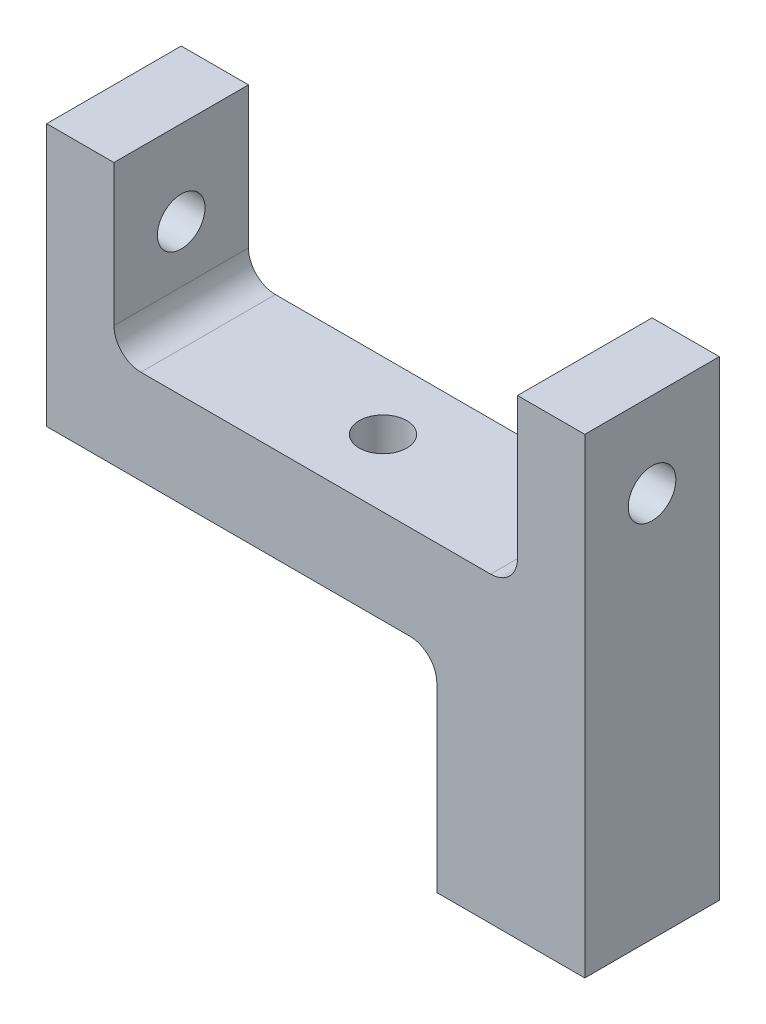
ISO-10303-21;
HEADER;
FILE_DESCRIPTION(('STEP AP214'),'2;1');
FILE_NAME('part.step','',(''),(''),'','','');
FILE_SCHEMA(('AUTOMOTIVE_DESIGN { 1 0 10303 214 1 1 1 1 }'));
ENDSEC;
DATA;
#1=APPLICATION_CONTEXT('core data for automotive mechanical design processes');
#2=APPLICATION_PROTOCOL_DEFINITION('international standard','automotive_design',2000,#1);
#3=PRODUCT_CONTEXT('',#1,'mechanical');
#4=PRODUCT('Part','Part','',(#3));
#5=PRODUCT_RELATED_PRODUCT_CATEGORY('part','',(#4));
#6=PRODUCT_DEFINITION_FORMATION('','',#4);
#7=PRODUCT_DEFINITION_CONTEXT('part definition',#1,'design');
#8=PRODUCT_DEFINITION('design','',#6,#7);
#9=PRODUCT_DEFINITION_SHAPE('','',#8);
#10=(LENGTH_UNIT() NAMED_UNIT(*) SI_UNIT(.MILLI.,.METRE.));
#11=(NAMED_UNIT(*) PLANE_ANGLE_UNIT() SI_UNIT($,.RADIAN.));
#12=(NAMED_UNIT(*) SI_UNIT($,.STERADIAN.) SOLID_ANGLE_UNIT());
#13=UNCERTAINTY_MEASURE_WITH_UNIT(LENGTH_MEASURE(1.E-05),#10,'distance_accuracy_value','');
#14=(GEOMETRIC_REPRESENTATION_CONTEXT(3) GLOBAL_UNCERTAINTY_ASSIGNED_CONTEXT((#13)) GLOBAL_UNIT_ASSIGNED_CONTEXT((#10,
#11,#12)) REPRESENTATION_CONTEXT('',''));
#15=CARTESIAN_POINT('',(0.,0.,0.));
#16=DIRECTION('',(0.,0.,1.));
#17=DIRECTION('',(1.,0.,0.));
#18=AXIS2_PLACEMENT_3D('',#15,#16,#17);
#19=CARTESIAN_POINT('',(25.4,44.45,6.35));
#20=DIRECTION('',(-1.,0.,0.));
#21=DIRECTION('',(0.,0.,1.));
#22=AXIS2_PLACEMENT_3D('',#19,#20,#21);
#23=PLANE('',#22);
#24=DIRECTION('',(0.,0.,-1.));
#25=VECTOR('',#24,1.);
#26=CARTESIAN_POINT('',(25.4,0.,6.35));
#27=LINE('',#26,#25);
#28=CARTESIAN_POINT('',(25.4,0.,6.35));
#29=VERTEX_POINT('',#28);
#30=CARTESIAN_POINT('',(25.4,0.,-6.35));
#31=VERTEX_POINT('',#30);
#32=EDGE_CURVE('E183',#29,#31,#27,.T.);
#33=ORIENTED_EDGE('',*,*,#32,.T.);
#34=DIRECTION('',(0.,-1.,0.));
#35=VECTOR('',#34,1.);
#36=CARTESIAN_POINT('',(25.4,44.45,-6.35));
#37=LINE('',#36,#35);
#38=CARTESIAN_POINT('',(25.4,44.45,-6.35));
#39=VERTEX_POINT('',#38);
#40=EDGE_CURVE('E231',#39,#31,#37,.T.);
#41=ORIENTED_EDGE('',*,*,#40,.F.);
#42=DIRECTION('',(0.,0.,-1.));
#43=VECTOR('',#42,1.);
#44=CARTESIAN_POINT('',(25.4,44.45,6.35));
#45=LINE('',#44,#43);
#46=CARTESIAN_POINT('',(25.4,44.45,6.35));
#47=VERTEX_POINT('',#46);
#48=EDGE_CURVE('E202',#47,#39,#45,.T.);
#49=ORIENTED_EDGE('',*,*,#48,.F.);
#50=DIRECTION('',(0.,-1.,0.));
#51=VECTOR('',#50,1.);
#52=CARTESIAN_POINT('',(25.4,44.45,6.35));
#53=LINE('',#52,#51);
#54=EDGE_CURVE('E216',#47,#29,#53,.T.);
#55=ORIENTED_EDGE('',*,*,#54,.T.);
#56=EDGE_LOOP('',(#33,#41,#49,#55));
#57=FACE_BOUND('',#56,.T.);
#58=CARTESIAN_POINT('',(25.4,36.4514924131544,0.));
#59=DIRECTION('',(1.,0.,0.));
#60=DIRECTION('',(0.,0.,-1.));
#61=AXIS2_PLACEMENT_3D('',#58,#59,#60);
#62=CIRCLE('',#61,2.24789999999999);
#63=CARTESIAN_POINT('',(25.4,36.4514924131544,-2.24789999999999));
#64=VERTEX_POINT('',#63);
#65=EDGE_CURVE('E155',#64,#64,#62,.T.);
#66=ORIENTED_EDGE('',*,*,#65,.F.);
#67=EDGE_LOOP('',(#66));
#68=FACE_BOUND('',#67,.T.);
#69=ADVANCED_FACE('F39',(#57,#68),#23,.F.);
#70=CARTESIAN_POINT('',(-25.4,44.45,-6.35));
#71=DIRECTION('',(0.,0.,1.));
#72=DIRECTION('',(1.,0.,0.));
#73=AXIS2_PLACEMENT_3D('',#70,#71,#72);
#74=PLANE('',#73);
#75=DIRECTION('',(0.,1.,0.));
#76=VECTOR('',#75,1.);
#77=CARTESIAN_POINT('',(11.43,0.,-6.35));
#78=LINE('',#77,#76);
#79=CARTESIAN_POINT('',(11.43,0.,-6.35));
#80=VERTEX_POINT('',#79);
#81=CARTESIAN_POINT('',(11.43,17.145,-6.35));
#82=VERTEX_POINT('',#81);
#83=EDGE_CURVE('E168',#80,#82,#78,.T.);
#84=ORIENTED_EDGE('',*,*,#83,.T.);
#85=CARTESIAN_POINT('',(8.89,17.145,-6.35));
#86=DIRECTION('',(0.,0.,1.));
#87=DIRECTION('',(1.,0.,0.));
#88=AXIS2_PLACEMENT_3D('',#85,#86,#87);
#89=CIRCLE('',#88,2.54);
#90=CARTESIAN_POINT('',(8.89,19.685,-6.35));
#91=VERTEX_POINT('',#90);
#92=EDGE_CURVE('E250',#82,#91,#89,.T.);
#93=ORIENTED_EDGE('',*,*,#92,.T.);
#94=DIRECTION('',(-1.,0.,0.));
#95=VECTOR('',#94,1.);
#96=CARTESIAN_POINT('',(0.,19.685,-6.35));
#97=LINE('',#96,#95);
#98=CARTESIAN_POINT('',(-25.4,19.685,-6.35));
#99=VERTEX_POINT('',#98);
#100=EDGE_CURVE('E171',#91,#99,#97,.T.);
#101=ORIENTED_EDGE('',*,*,#100,.T.);
#102=DIRECTION('',(0.,-1.,0.));
#103=VECTOR('',#102,1.);
#104=CARTESIAN_POINT('',(-25.4,44.45,-6.35));
#105=LINE('',#104,#103);
#106=CARTESIAN_POINT('',(-25.4,44.45,-6.35));
#107=VERTEX_POINT('',#106);
#108=EDGE_CURVE('E228',#107,#99,#105,.T.);
#109=ORIENTED_EDGE('',*,*,#108,.F.);
#110=DIRECTION('',(-1.,0.,0.));
#111=VECTOR('',#110,1.);
#112=CARTESIAN_POINT('',(-25.4,44.45,-6.35));
#113=LINE('',#112,#111);
#114=CARTESIAN_POINT('',(-19.05,44.45,-6.35));
#115=VERTEX_POINT('',#114);
#116=EDGE_CURVE('E205',#115,#107,#113,.T.);
#117=ORIENTED_EDGE('',*,*,#116,.F.);
#118=DIRECTION('',(0.,1.,0.));
#119=VECTOR('',#118,1.);
#120=CARTESIAN_POINT('',(-19.05,0.,-6.35));
#121=LINE('',#120,#119);
#122=CARTESIAN_POINT('',(-19.05,31.115,-6.35));
#123=VERTEX_POINT('',#122);
#124=EDGE_CURVE('E190',#123,#115,#121,.T.);
#125=ORIENTED_EDGE('',*,*,#124,.F.);
#126=CARTESIAN_POINT('',(-16.51,31.115,-6.35));
#127=DIRECTION('',(0.,0.,1.));
#128=DIRECTION('',(1.,0.,0.));
#129=AXIS2_PLACEMENT_3D('',#126,#127,#128);
#130=CIRCLE('',#129,2.54);
#131=CARTESIAN_POINT('',(-16.51,28.575,-6.35));
#132=VERTEX_POINT('',#131);
#133=EDGE_CURVE('E254',#123,#132,#130,.T.);
#134=ORIENTED_EDGE('',*,*,#133,.T.);
#135=DIRECTION('',(1.,0.,0.));
#136=VECTOR('',#135,1.);
#137=CARTESIAN_POINT('',(0.,28.575,-6.35));
#138=LINE('',#137,#136);
#139=CARTESIAN_POINT('',(16.51,28.575,-6.35));
#140=VERTEX_POINT('',#139);
#141=EDGE_CURVE('E185',#132,#140,#138,.T.);
#142=ORIENTED_EDGE('',*,*,#141,.T.);
#143=CARTESIAN_POINT('',(16.51,31.115,-6.35));
#144=DIRECTION('',(0.,0.,1.));
#145=DIRECTION('',(1.,0.,0.));
#146=AXIS2_PLACEMENT_3D('',#143,#144,#145);
#147=CIRCLE('',#146,2.54);
#148=CARTESIAN_POINT('',(19.05,31.115,-6.35));
#149=VERTEX_POINT('',#148);
#150=EDGE_CURVE('E11',#140,#149,#147,.T.);
#151=ORIENTED_EDGE('',*,*,#150,.T.);
#152=DIRECTION('',(0.,1.,0.));
#153=VECTOR('',#152,1.);
#154=CARTESIAN_POINT('',(19.05,0.,-6.35));
#155=LINE('',#154,#153);
#156=CARTESIAN_POINT('',(19.05,44.45,-6.35));
#157=VERTEX_POINT('',#156);
#158=EDGE_CURVE('E187',#149,#157,#155,.T.);
#159=ORIENTED_EDGE('',*,*,#158,.T.);
#160=EDGE_CURVE('E207',#39,#157,#113,.T.);
#161=ORIENTED_EDGE('',*,*,#160,.F.);
#162=ORIENTED_EDGE('',*,*,#40,.T.);
#163=DIRECTION('',(-1.,0.,0.));
#164=VECTOR('',#163,1.);
#165=CARTESIAN_POINT('',(-25.4,0.,-6.35));
#166=LINE('',#165,#164);
#167=EDGE_CURVE('E219',#31,#80,#166,.T.);
#168=ORIENTED_EDGE('',*,*,#167,.T.);
#169=EDGE_LOOP('',(#84,#93,#101,#109,#117,#125,#134,#142,#151,#159,#161,#162,#168));
#170=FACE_BOUND('',#169,.T.);
#171=ADVANCED_FACE('F267',(#170),#74,.F.);
#172=CARTESIAN_POINT('',(-25.4,44.45,6.35));
#173=DIRECTION('',(0.,0.,-1.));
#174=DIRECTION('',(-1.,0.,0.));
#175=AXIS2_PLACEMENT_3D('',#172,#173,#174);
#176=PLANE('',#175);
#177=DIRECTION('',(0.,-1.,0.));
#178=VECTOR('',#177,1.);
#179=CARTESIAN_POINT('',(-25.4,44.45,6.35));
#180=LINE('',#179,#178);
#181=CARTESIAN_POINT('',(-25.4,44.45,6.35));
#182=VERTEX_POINT('',#181);
#183=CARTESIAN_POINT('',(-25.4,19.685,6.35));
#184=VERTEX_POINT('',#183);
#185=EDGE_CURVE('E225',#182,#184,#180,.T.);
#186=ORIENTED_EDGE('',*,*,#185,.T.);
#187=DIRECTION('',(-1.,0.,0.));
#188=VECTOR('',#187,1.);
#189=CARTESIAN_POINT('',(0.,19.685,6.35));
#190=LINE('',#189,#188);
#191=CARTESIAN_POINT('',(8.89,19.685,6.35));
#192=VERTEX_POINT('',#191);
#193=EDGE_CURVE('E172',#192,#184,#190,.T.);
#194=ORIENTED_EDGE('',*,*,#193,.F.);
#195=CARTESIAN_POINT('',(8.89,17.145,6.35));
#196=DIRECTION('',(0.,0.,-1.));
#197=DIRECTION('',(-1.,0.,0.));
#198=AXIS2_PLACEMENT_3D('',#195,#196,#197);
#199=CIRCLE('',#198,2.54);
#200=CARTESIAN_POINT('',(11.43,17.145,6.35));
#201=VERTEX_POINT('',#200);
#202=EDGE_CURVE('E248',#192,#201,#199,.T.);
#203=ORIENTED_EDGE('',*,*,#202,.T.);
#204=DIRECTION('',(0.,1.,0.));
#205=VECTOR('',#204,1.);
#206=CARTESIAN_POINT('',(11.43,0.,6.35));
#207=LINE('',#206,#205);
#208=CARTESIAN_POINT('',(11.43,0.,6.35));
#209=VERTEX_POINT('',#208);
#210=EDGE_CURVE('E175',#209,#201,#207,.T.);
#211=ORIENTED_EDGE('',*,*,#210,.F.);
#212=DIRECTION('',(1.,0.,0.));
#213=VECTOR('',#212,1.);
#214=CARTESIAN_POINT('',(-25.4,0.,6.35));
#215=LINE('',#214,#213);
#216=EDGE_CURVE('E206',#209,#29,#215,.T.);
#217=ORIENTED_EDGE('',*,*,#216,.T.);
#218=ORIENTED_EDGE('',*,*,#54,.F.);
#219=DIRECTION('',(1.,0.,0.));
#220=VECTOR('',#219,1.);
#221=CARTESIAN_POINT('',(-25.4,44.45,6.35));
#222=LINE('',#221,#220);
#223=CARTESIAN_POINT('',(19.05,44.45,6.35));
#224=VERTEX_POINT('',#223);
#225=EDGE_CURVE('E212',#224,#47,#222,.T.);
#226=ORIENTED_EDGE('',*,*,#225,.F.);
#227=DIRECTION('',(0.,1.,0.));
#228=VECTOR('',#227,1.);
#229=CARTESIAN_POINT('',(19.05,0.,6.35));
#230=LINE('',#229,#228);
#231=CARTESIAN_POINT('',(19.05,31.115,6.35));
#232=VERTEX_POINT('',#231);
#233=EDGE_CURVE('E195',#232,#224,#230,.T.);
#234=ORIENTED_EDGE('',*,*,#233,.F.);
#235=CARTESIAN_POINT('',(16.51,31.115,6.35));
#236=DIRECTION('',(0.,0.,-1.));
#237=DIRECTION('',(-1.,0.,0.));
#238=AXIS2_PLACEMENT_3D('',#235,#236,#237);
#239=CIRCLE('',#238,2.54);
#240=CARTESIAN_POINT('',(16.51,28.575,6.35));
#241=VERTEX_POINT('',#240);
#242=EDGE_CURVE('E47',#232,#241,#239,.T.);
#243=ORIENTED_EDGE('',*,*,#242,.T.);
#244=DIRECTION('',(1.,0.,0.));
#245=VECTOR('',#244,1.);
#246=CARTESIAN_POINT('',(0.,28.575,6.35));
#247=LINE('',#246,#245);
#248=CARTESIAN_POINT('',(-16.51,28.575,6.35));
#249=VERTEX_POINT('',#248);
#250=EDGE_CURVE('E167',#249,#241,#247,.T.);
#251=ORIENTED_EDGE('',*,*,#250,.F.);
#252=CARTESIAN_POINT('',(-16.51,31.115,6.35));
#253=DIRECTION('',(0.,0.,-1.));
#254=DIRECTION('',(-1.,0.,0.));
#255=AXIS2_PLACEMENT_3D('',#252,#253,#254);
#256=CIRCLE('',#255,2.54);
#257=CARTESIAN_POINT('',(-19.05,31.115,6.35));
#258=VERTEX_POINT('',#257);
#259=EDGE_CURVE('E252',#249,#258,#256,.T.);
#260=ORIENTED_EDGE('',*,*,#259,.T.);
#261=DIRECTION('',(0.,1.,0.));
#262=VECTOR('',#261,1.);
#263=CARTESIAN_POINT('',(-19.05,0.,6.35));
#264=LINE('',#263,#262);
#265=CARTESIAN_POINT('',(-19.05,44.45,6.35));
#266=VERTEX_POINT('',#265);
#267=EDGE_CURVE('E188',#258,#266,#264,.T.);
#268=ORIENTED_EDGE('',*,*,#267,.T.);
#269=EDGE_CURVE('E213',#182,#266,#222,.T.);
#270=ORIENTED_EDGE('',*,*,#269,.F.);
#271=EDGE_LOOP('',(#186,#194,#203,#211,#217,#218,#226,#234,#243,#251,#260,#268,#270));
#272=FACE_BOUND('',#271,.T.);
#273=ADVANCED_FACE('F258',(#272),#176,.F.);
#274=CARTESIAN_POINT('',(0.,44.45,0.));
#275=DIRECTION('',(0.,-1.,0.));
#276=DIRECTION('',(0.,0.,-1.));
#277=AXIS2_PLACEMENT_3D('',#274,#275,#276);
#278=PLANE('',#277);
#279=DIRECTION('',(0.,0.,1.));
#280=VECTOR('',#279,1.);
#281=CARTESIAN_POINT('',(-19.05,44.45,-6.35));
#282=LINE('',#281,#280);
#283=EDGE_CURVE('E178',#115,#266,#282,.T.);
#284=ORIENTED_EDGE('',*,*,#283,.F.);
#285=ORIENTED_EDGE('',*,*,#116,.T.);
#286=DIRECTION('',(0.,0.,1.));
#287=VECTOR('',#286,1.);
#288=CARTESIAN_POINT('',(-25.4,44.45,6.35));
#289=LINE('',#288,#287);
#290=EDGE_CURVE('E210',#107,#182,#289,.T.);
#291=ORIENTED_EDGE('',*,*,#290,.T.);
#292=ORIENTED_EDGE('',*,*,#269,.T.);
#293=EDGE_LOOP('',(#284,#285,#291,#292));
#294=FACE_BOUND('',#293,.T.);
#295=ADVANCED_FACE('F303',(#294),#278,.F.);
#296=CARTESIAN_POINT('',(-25.4,44.45,6.35));
#297=DIRECTION('',(1.,0.,0.));
#298=DIRECTION('',(0.,0.,-1.));
#299=AXIS2_PLACEMENT_3D('',#296,#297,#298);
#300=PLANE('',#299);
#301=CARTESIAN_POINT('',(-25.4,36.4514924131544,0.));
#302=DIRECTION('',(1.,0.,0.));
#303=DIRECTION('',(0.,0.,-1.));
#304=AXIS2_PLACEMENT_3D('',#301,#302,#303);
#305=CIRCLE('',#304,2.24789999999999);
#306=CARTESIAN_POINT('',(-25.4,36.4514924131544,-2.24789999999999));
#307=VERTEX_POINT('',#306);
#308=EDGE_CURVE('E158',#307,#307,#305,.T.);
#309=ORIENTED_EDGE('',*,*,#308,.T.);
#310=EDGE_LOOP('',(#309));
#311=FACE_BOUND('',#310,.T.);
#312=ORIENTED_EDGE('',*,*,#108,.T.);
#313=DIRECTION('',(0.,0.,1.));
#314=VECTOR('',#313,1.);
#315=CARTESIAN_POINT('',(-25.4,19.685,-6.35));
#316=LINE('',#315,#314);
#317=EDGE_CURVE('E180',#99,#184,#316,.T.);
#318=ORIENTED_EDGE('',*,*,#317,.T.);
#319=ORIENTED_EDGE('',*,*,#185,.F.);
#320=ORIENTED_EDGE('',*,*,#290,.F.);
#321=EDGE_LOOP('',(#312,#318,#319,#320));
#322=FACE_BOUND('',#321,.T.);
#323=ADVANCED_FACE('F296',(#311,#322),#300,.F.);
#324=ORIENTED_EDGE('',*,*,#160,.T.);
#325=DIRECTION('',(0.,0.,1.));
#326=VECTOR('',#325,1.);
#327=CARTESIAN_POINT('',(19.05,44.45,-6.35));
#328=LINE('',#327,#326);
#329=EDGE_CURVE('E192',#157,#224,#328,.T.);
#330=ORIENTED_EDGE('',*,*,#329,.T.);
#331=ORIENTED_EDGE('',*,*,#225,.T.);
#332=ORIENTED_EDGE('',*,*,#48,.T.);
#333=EDGE_LOOP('',(#324,#330,#331,#332));
#334=FACE_BOUND('',#333,.T.);
#335=ADVANCED_FACE('F271',(#334),#278,.F.);
#336=CARTESIAN_POINT('',(0.,0.,0.));
#337=DIRECTION('',(0.,-1.,0.));
#338=DIRECTION('',(0.,0.,-1.));
#339=AXIS2_PLACEMENT_3D('',#336,#337,#338);
#340=PLANE('',#339);
#341=DIRECTION('',(0.,0.,1.));
#342=VECTOR('',#341,1.);
#343=CARTESIAN_POINT('',(11.43,0.,-6.35));
#344=LINE('',#343,#342);
#345=EDGE_CURVE('E174',#80,#209,#344,.T.);
#346=ORIENTED_EDGE('',*,*,#345,.F.);
#347=ORIENTED_EDGE('',*,*,#167,.F.);
#348=ORIENTED_EDGE('',*,*,#32,.F.);
#349=ORIENTED_EDGE('',*,*,#216,.F.);
#350=EDGE_LOOP('',(#346,#347,#348,#349));
#351=FACE_BOUND('',#350,.T.);
#352=ADVANCED_FACE('F279',(#351),#340,.T.);
#353=CARTESIAN_POINT('',(0.,19.685,-6.35));
#354=DIRECTION('',(0.,1.,0.));
#355=DIRECTION('',(-1.,0.,0.));
#356=AXIS2_PLACEMENT_3D('',#353,#354,#355);
#357=PLANE('',#356);
#358=CARTESIAN_POINT('',(0.,19.685,0.));
#359=DIRECTION('',(0.,1.,0.));
#360=DIRECTION('',(-1.,0.,0.));
#361=AXIS2_PLACEMENT_3D('',#358,#359,#360);
#362=CIRCLE('',#361,2.24789999999999);
#363=CARTESIAN_POINT('',(-2.24789999999999,19.685,0.));
#364=VERTEX_POINT('',#363);
#365=EDGE_CURVE('E148',#364,#364,#362,.T.);
#366=ORIENTED_EDGE('',*,*,#365,.T.);
#367=EDGE_LOOP('',(#366));
#368=FACE_BOUND('',#367,.T.);
#369=ORIENTED_EDGE('',*,*,#100,.F.);
#370=DIRECTION('',(0.,0.,1.));
#371=VECTOR('',#370,1.);
#372=CARTESIAN_POINT('',(8.89,19.685,6.35));
#373=LINE('',#372,#371);
#374=EDGE_CURVE('E234',#91,#192,#373,.T.);
#375=ORIENTED_EDGE('',*,*,#374,.T.);
#376=ORIENTED_EDGE('',*,*,#193,.T.);
#377=ORIENTED_EDGE('',*,*,#317,.F.);
#378=EDGE_LOOP('',(#369,#375,#376,#377));
#379=FACE_BOUND('',#378,.T.);
#380=ADVANCED_FACE('F289',(#368,#379),#357,.F.);
#381=CARTESIAN_POINT('',(11.43,0.,-6.35));
#382=DIRECTION('',(1.,0.,0.));
#383=DIRECTION('',(0.,1.,0.));
#384=AXIS2_PLACEMENT_3D('',#381,#382,#383);
#385=PLANE('',#384);
#386=CARTESIAN_POINT('',(11.43,6.09600000000001,0.));
#387=DIRECTION('',(-1.,0.,0.));
#388=DIRECTION('',(0.,0.,1.));
#389=AXIS2_PLACEMENT_3D('',#386,#387,#388);
#390=CIRCLE('',#389,2.28599999999999);
#391=CARTESIAN_POINT('',(11.43,6.09600000000001,2.28599999999999));
#392=VERTEX_POINT('',#391);
#393=EDGE_CURVE('E145',#392,#392,#390,.T.);
#394=ORIENTED_EDGE('',*,*,#393,.F.);
#395=EDGE_LOOP('',(#394));
#396=FACE_BOUND('',#395,.T.);
#397=ORIENTED_EDGE('',*,*,#210,.T.);
#398=DIRECTION('',(0.,0.,1.));
#399=VECTOR('',#398,1.);
#400=CARTESIAN_POINT('',(11.43,17.145,-6.35));
#401=LINE('',#400,#399);
#402=EDGE_CURVE('E237',#201,#82,#401,.F.);
#403=ORIENTED_EDGE('',*,*,#402,.T.);
#404=ORIENTED_EDGE('',*,*,#83,.F.);
#405=ORIENTED_EDGE('',*,*,#345,.T.);
#406=EDGE_LOOP('',(#397,#403,#404,#405));
#407=FACE_BOUND('',#406,.T.);
#408=ADVANCED_FACE('F334',(#396,#407),#385,.F.);
#409=CARTESIAN_POINT('',(0.,28.575,-6.35));
#410=DIRECTION('',(0.,-1.,0.));
#411=DIRECTION('',(0.,0.,-1.));
#412=AXIS2_PLACEMENT_3D('',#409,#410,#411);
#413=PLANE('',#412);
#414=CARTESIAN_POINT('',(0.,28.575,0.));
#415=DIRECTION('',(0.,1.,0.));
#416=DIRECTION('',(0.,0.,1.));
#417=AXIS2_PLACEMENT_3D('',#414,#415,#416);
#418=CIRCLE('',#417,2.24789999999999);
#419=CARTESIAN_POINT('',(0.,28.575,2.24789999999999));
#420=VERTEX_POINT('',#419);
#421=EDGE_CURVE('E144',#420,#420,#418,.T.);
#422=ORIENTED_EDGE('',*,*,#421,.F.);
#423=EDGE_LOOP('',(#422));
#424=FACE_BOUND('',#423,.T.);
#425=ORIENTED_EDGE('',*,*,#141,.F.);
#426=DIRECTION('',(0.,0.,1.));
#427=VECTOR('',#426,1.);
#428=CARTESIAN_POINT('',(-16.51,28.575,-6.35));
#429=LINE('',#428,#427);
#430=EDGE_CURVE('E241',#132,#249,#429,.T.);
#431=ORIENTED_EDGE('',*,*,#430,.T.);
#432=ORIENTED_EDGE('',*,*,#250,.T.);
#433=DIRECTION('',(0.,0.,1.));
#434=VECTOR('',#433,1.);
#435=CARTESIAN_POINT('',(16.51,28.575,-6.35));
#436=LINE('',#435,#434);
#437=EDGE_CURVE('E239',#241,#140,#436,.F.);
#438=ORIENTED_EDGE('',*,*,#437,.T.);
#439=EDGE_LOOP('',(#425,#431,#432,#438));
#440=FACE_BOUND('',#439,.T.);
#441=ADVANCED_FACE('F262',(#424,#440),#413,.F.);
#442=CARTESIAN_POINT('',(-19.05,0.,-6.35));
#443=DIRECTION('',(1.,0.,0.));
#444=DIRECTION('',(0.,0.,-1.));
#445=AXIS2_PLACEMENT_3D('',#442,#443,#444);
#446=PLANE('',#445);
#447=CARTESIAN_POINT('',(-19.05,36.4514924131544,0.));
#448=DIRECTION('',(1.,0.,0.));
#449=DIRECTION('',(0.,0.,-1.));
#450=AXIS2_PLACEMENT_3D('',#447,#448,#449);
#451=CIRCLE('',#450,2.24789999999999);
#452=CARTESIAN_POINT('',(-19.05,36.4514924131544,-2.24789999999999));
#453=VERTEX_POINT('',#452);
#454=EDGE_CURVE('E164',#453,#453,#451,.T.);
#455=ORIENTED_EDGE('',*,*,#454,.F.);
#456=EDGE_LOOP('',(#455));
#457=FACE_BOUND('',#456,.T.);
#458=ORIENTED_EDGE('',*,*,#267,.F.);
#459=DIRECTION('',(0.,0.,1.));
#460=VECTOR('',#459,1.);
#461=CARTESIAN_POINT('',(-19.05,31.115,-6.35));
#462=LINE('',#461,#460);
#463=EDGE_CURVE('E244',#258,#123,#462,.F.);
#464=ORIENTED_EDGE('',*,*,#463,.T.);
#465=ORIENTED_EDGE('',*,*,#124,.T.);
#466=ORIENTED_EDGE('',*,*,#283,.T.);
#467=EDGE_LOOP('',(#458,#464,#465,#466));
#468=FACE_BOUND('',#467,.T.);
#469=ADVANCED_FACE('F306',(#457,#468),#446,.T.);
#470=CARTESIAN_POINT('',(19.05,0.,-6.35));
#471=DIRECTION('',(1.,0.,0.));
#472=DIRECTION('',(0.,0.,-1.));
#473=AXIS2_PLACEMENT_3D('',#470,#471,#472);
#474=PLANE('',#473);
#475=CARTESIAN_POINT('',(19.05,36.4514924131544,0.));
#476=DIRECTION('',(1.,0.,0.));
#477=DIRECTION('',(0.,0.,-1.));
#478=AXIS2_PLACEMENT_3D('',#475,#476,#477);
#479=CIRCLE('',#478,2.24789999999999);
#480=CARTESIAN_POINT('',(19.05,36.4514924131544,-2.24789999999999));
#481=VERTEX_POINT('',#480);
#482=EDGE_CURVE('E161',#481,#481,#479,.T.);
#483=ORIENTED_EDGE('',*,*,#482,.T.);
#484=EDGE_LOOP('',(#483));
#485=FACE_BOUND('',#484,.T.);
#486=ORIENTED_EDGE('',*,*,#158,.F.);
#487=DIRECTION('',(0.,0.,1.));
#488=VECTOR('',#487,1.);
#489=CARTESIAN_POINT('',(19.05,31.115,6.35));
#490=LINE('',#489,#488);
#491=EDGE_CURVE('E246',#149,#232,#490,.T.);
#492=ORIENTED_EDGE('',*,*,#491,.T.);
#493=ORIENTED_EDGE('',*,*,#233,.T.);
#494=ORIENTED_EDGE('',*,*,#329,.F.);
#495=EDGE_LOOP('',(#486,#492,#493,#494));
#496=FACE_BOUND('',#495,.T.);
#497=ADVANCED_FACE('F265',(#485,#496),#474,.F.);
#498=CARTESIAN_POINT('',(25.4,36.4514924131544,0.));
#499=DIRECTION('',(1.,0.,0.));
#500=DIRECTION('',(0.,0.,-1.));
#501=AXIS2_PLACEMENT_3D('',#498,#499,#500);
#502=CYLINDRICAL_SURFACE('',#501,2.24789999999999);
#503=ORIENTED_EDGE('',*,*,#65,.T.);
#504=EDGE_LOOP('',(#503));
#505=FACE_BOUND('',#504,.T.);
#506=ORIENTED_EDGE('',*,*,#482,.F.);
#507=EDGE_LOOP('',(#506));
#508=FACE_BOUND('',#507,.T.);
#509=ADVANCED_FACE('F338',(#505,#508),#502,.F.);
#510=ORIENTED_EDGE('',*,*,#454,.T.);
#511=EDGE_LOOP('',(#510));
#512=FACE_BOUND('',#511,.T.);
#513=ORIENTED_EDGE('',*,*,#308,.F.);
#514=EDGE_LOOP('',(#513));
#515=FACE_BOUND('',#514,.T.);
#516=ADVANCED_FACE('F349',(#512,#515),#502,.F.);
#517=CARTESIAN_POINT('',(0.,28.575,0.));
#518=DIRECTION('',(0.,1.,0.));
#519=DIRECTION('',(0.,0.,1.));
#520=AXIS2_PLACEMENT_3D('',#517,#518,#519);
#521=CYLINDRICAL_SURFACE('',#520,2.24789999999999);
#522=ORIENTED_EDGE('',*,*,#421,.T.);
#523=EDGE_LOOP('',(#522));
#524=FACE_BOUND('',#523,.T.);
#525=ORIENTED_EDGE('',*,*,#365,.F.);
#526=EDGE_LOOP('',(#525));
#527=FACE_BOUND('',#526,.T.);
#528=ADVANCED_FACE('F138',(#524,#527),#521,.F.);
#529=CARTESIAN_POINT('',(19.05,6.09600000000001,0.));
#530=DIRECTION('',(-1.,0.,0.));
#531=DIRECTION('',(0.,0.,1.));
#532=AXIS2_PLACEMENT_3D('',#529,#530,#531);
#533=CONICAL_SURFACE('',#532,2.286,1.02974425867665);
#534=CARTESIAN_POINT('',(20.423567375097,6.096,0.));
#535=VERTEX_POINT('',#534);
#536=VERTEX_LOOP('',#535);
#537=FACE_BOUND('',#536,.T.);
#538=CARTESIAN_POINT('',(19.05,6.09600000000001,0.));
#539=DIRECTION('',(-1.,0.,0.));
#540=DIRECTION('',(0.,0.,1.));
#541=AXIS2_PLACEMENT_3D('',#538,#539,#540);
#542=CIRCLE('',#541,2.286);
#543=CARTESIAN_POINT('',(19.05,6.09600000000001,2.286));
#544=VERTEX_POINT('',#543);
#545=EDGE_CURVE('E142',#544,#544,#542,.T.);
#546=ORIENTED_EDGE('',*,*,#545,.T.);
#547=EDGE_LOOP('',(#546));
#548=FACE_BOUND('',#547,.T.);
#549=ADVANCED_FACE('F134',(#537,#548),#533,.F.);
#550=CARTESIAN_POINT('',(11.43,6.09600000000001,0.));
#551=DIRECTION('',(-1.,0.,0.));
#552=DIRECTION('',(0.,0.,1.));
#553=AXIS2_PLACEMENT_3D('',#550,#551,#552);
#554=CYLINDRICAL_SURFACE('',#553,2.28599999999999);
#555=ORIENTED_EDGE('',*,*,#545,.F.);
#556=EDGE_LOOP('',(#555));
#557=FACE_BOUND('',#556,.T.);
#558=ORIENTED_EDGE('',*,*,#393,.T.);
#559=EDGE_LOOP('',(#558));
#560=FACE_BOUND('',#559,.T.);
#561=ADVANCED_FACE('F137',(#557,#560),#554,.F.);
#562=CARTESIAN_POINT('',(8.89,17.145,-6.35));
#563=DIRECTION('',(0.,0.,-1.));
#564=DIRECTION('',(-1.,0.,0.));
#565=AXIS2_PLACEMENT_3D('',#562,#563,#564);
#566=CYLINDRICAL_SURFACE('',#565,2.54);
#567=ORIENTED_EDGE('',*,*,#92,.F.);
#568=ORIENTED_EDGE('',*,*,#402,.F.);
#569=ORIENTED_EDGE('',*,*,#202,.F.);
#570=ORIENTED_EDGE('',*,*,#374,.F.);
#571=EDGE_LOOP('',(#567,#568,#569,#570));
#572=FACE_BOUND('',#571,.T.);
#573=ADVANCED_FACE('F286',(#572),#566,.F.);
#574=CARTESIAN_POINT('',(-16.51,31.115,-6.35));
#575=DIRECTION('',(0.,0.,1.));
#576=DIRECTION('',(1.,0.,0.));
#577=AXIS2_PLACEMENT_3D('',#574,#575,#576);
#578=CYLINDRICAL_SURFACE('',#577,2.54);
#579=ORIENTED_EDGE('',*,*,#133,.F.);
#580=ORIENTED_EDGE('',*,*,#463,.F.);
#581=ORIENTED_EDGE('',*,*,#259,.F.);
#582=ORIENTED_EDGE('',*,*,#430,.F.);
#583=EDGE_LOOP('',(#579,#580,#581,#582));
#584=FACE_BOUND('',#583,.T.);
#585=ADVANCED_FACE('F309',(#584),#578,.F.);
#586=CARTESIAN_POINT('',(16.51,31.115,-6.35));
#587=DIRECTION('',(0.,0.,-1.));
#588=DIRECTION('',(-1.,0.,0.));
#589=AXIS2_PLACEMENT_3D('',#586,#587,#588);
#590=CYLINDRICAL_SURFACE('',#589,2.54);
#591=ORIENTED_EDGE('',*,*,#150,.F.);
#592=ORIENTED_EDGE('',*,*,#437,.F.);
#593=ORIENTED_EDGE('',*,*,#242,.F.);
#594=ORIENTED_EDGE('',*,*,#491,.F.);
#595=EDGE_LOOP('',(#591,#592,#593,#594));
#596=FACE_BOUND('',#595,.T.);
#597=ADVANCED_FACE('F41',(#596),#590,.F.);
#598=CLOSED_SHELL('',(#69,#171,#273,#295,#323,#335,#352,#380,#408,#441,#469,#497,#509,#516,#528,
#549,#561,#573,#585,#597));
#599=MANIFOLD_SOLID_BREP('B2',#598);
#600=ADVANCED_BREP_SHAPE_REPRESENTATION('',(#18,#599),#14);
#601=SHAPE_DEFINITION_REPRESENTATION(#9,#600);
ENDSEC;
END-ISO-10303-21;
